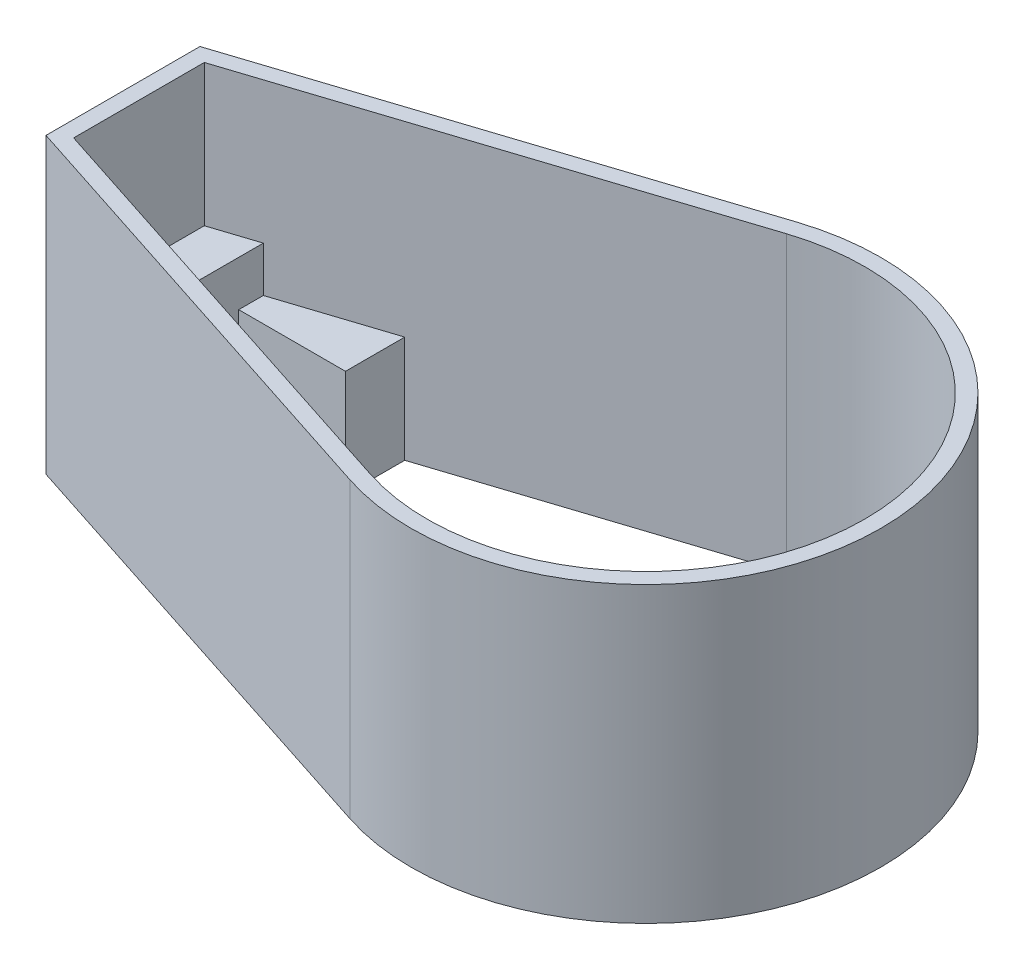
ISO-10303-21;
HEADER;
FILE_DESCRIPTION(('STEP AP214'),'2;1');
FILE_NAME('part.step','',(''),(''),'','','');
FILE_SCHEMA(('AUTOMOTIVE_DESIGN { 1 0 10303 214 1 1 1 1 }'));
ENDSEC;
DATA;
#1=APPLICATION_CONTEXT('core data for automotive mechanical design processes');
#2=APPLICATION_PROTOCOL_DEFINITION('international standard','automotive_design',2000,#1);
#3=PRODUCT_CONTEXT('',#1,'mechanical');
#4=PRODUCT('Part','Part','',(#3));
#5=PRODUCT_RELATED_PRODUCT_CATEGORY('part','',(#4));
#6=PRODUCT_DEFINITION_FORMATION('','',#4);
#7=PRODUCT_DEFINITION_CONTEXT('part definition',#1,'design');
#8=PRODUCT_DEFINITION('design','',#6,#7);
#9=PRODUCT_DEFINITION_SHAPE('','',#8);
#10=(LENGTH_UNIT() NAMED_UNIT(*) SI_UNIT(.MILLI.,.METRE.));
#11=(NAMED_UNIT(*) PLANE_ANGLE_UNIT() SI_UNIT($,.RADIAN.));
#12=(NAMED_UNIT(*) SI_UNIT($,.STERADIAN.) SOLID_ANGLE_UNIT());
#13=UNCERTAINTY_MEASURE_WITH_UNIT(LENGTH_MEASURE(1.E-05),#10,'distance_accuracy_value','');
#14=(GEOMETRIC_REPRESENTATION_CONTEXT(3) GLOBAL_UNCERTAINTY_ASSIGNED_CONTEXT((#13)) GLOBAL_UNIT_ASSIGNED_CONTEXT((#10,
#11,#12)) REPRESENTATION_CONTEXT('',''));
#15=CARTESIAN_POINT('',(0.,0.,0.));
#16=DIRECTION('',(0.,0.,1.));
#17=DIRECTION('',(1.,0.,0.));
#18=AXIS2_PLACEMENT_3D('',#15,#16,#17);
#19=CARTESIAN_POINT('',(-94.9999957586174,55.,-12.242580547085));
#20=DIRECTION('',(1.,0.,0.));
#21=DIRECTION('',(0.,0.,-1.));
#22=AXIS2_PLACEMENT_3D('',#19,#20,#21);
#23=PLANE('',#22);
#24=DIRECTION('',(0.,-1.,0.));
#25=VECTOR('',#24,1.);
#26=CARTESIAN_POINT('',(-94.9999957586174,55.,12.242580547085));
#27=LINE('',#26,#25);
#28=CARTESIAN_POINT('',(-94.9999957586174,55.,12.242580547085));
#29=VERTEX_POINT('',#28);
#30=CARTESIAN_POINT('',(-94.9999957586174,28.5,12.242580547085));
#31=VERTEX_POINT('',#30);
#32=EDGE_CURVE('E88',#29,#31,#27,.T.);
#33=ORIENTED_EDGE('',*,*,#32,.T.);
#34=DIRECTION('',(0.,0.,-1.));
#35=VECTOR('',#34,1.);
#36=CARTESIAN_POINT('',(-94.9999957586174,28.5,12.242580547085));
#37=LINE('',#36,#35);
#38=CARTESIAN_POINT('',(-94.9999957586174,28.5,-12.242580547085));
#39=VERTEX_POINT('',#38);
#40=EDGE_CURVE('E242',#31,#39,#37,.T.);
#41=ORIENTED_EDGE('',*,*,#40,.T.);
#42=DIRECTION('',(0.,-1.,0.));
#43=VECTOR('',#42,1.);
#44=CARTESIAN_POINT('',(-94.9999957586174,55.,-12.242580547085));
#45=LINE('',#44,#43);
#46=CARTESIAN_POINT('',(-94.9999957586174,55.,-12.242580547085));
#47=VERTEX_POINT('',#46);
#48=EDGE_CURVE('E271',#47,#39,#45,.T.);
#49=ORIENTED_EDGE('',*,*,#48,.F.);
#50=DIRECTION('',(0.,0.,1.));
#51=VECTOR('',#50,1.);
#52=CARTESIAN_POINT('',(-94.9999957586174,55.,-12.242580547085));
#53=LINE('',#52,#51);
#54=EDGE_CURVE('E258',#47,#29,#53,.T.);
#55=ORIENTED_EDGE('',*,*,#54,.T.);
#56=EDGE_LOOP('',(#33,#41,#49,#55));
#57=FACE_BOUND('',#56,.T.);
#58=ADVANCED_FACE('F63',(#57),#23,.T.);
#59=CARTESIAN_POINT('',(0.,55.,0.));
#60=DIRECTION('',(0.,-1.,0.));
#61=DIRECTION('',(0.,0.,-1.));
#62=AXIS2_PLACEMENT_3D('',#59,#60,#61);
#63=CYLINDRICAL_SURFACE('',#62,44.0000014399643);
#64=CARTESIAN_POINT('',(0.,0.,0.));
#65=DIRECTION('',(0.,-1.,0.));
#66=DIRECTION('',(0.,0.,-1.));
#67=AXIS2_PLACEMENT_3D('',#64,#65,#66);
#68=CIRCLE('',#67,44.0000014399643);
#69=CARTESIAN_POINT('',(-13.5967492993451,0.,-41.8464877284536));
#70=VERTEX_POINT('',#69);
#71=CARTESIAN_POINT('',(-13.5967492993451,0.,41.8464877284536));
#72=VERTEX_POINT('',#71);
#73=EDGE_CURVE('E270',#70,#72,#68,.T.);
#74=ORIENTED_EDGE('',*,*,#73,.F.);
#75=DIRECTION('',(0.,-1.,0.));
#76=VECTOR('',#75,1.);
#77=CARTESIAN_POINT('',(-13.5967492993451,55.,-41.8464877284536));
#78=LINE('',#77,#76);
#79=CARTESIAN_POINT('',(-13.5967492993451,55.,-41.8464877284536));
#80=VERTEX_POINT('',#79);
#81=EDGE_CURVE('E12',#80,#70,#78,.T.);
#82=ORIENTED_EDGE('',*,*,#81,.F.);
#83=CARTESIAN_POINT('',(0.,55.,0.));
#84=DIRECTION('',(0.,-1.,0.));
#85=DIRECTION('',(0.,0.,-1.));
#86=AXIS2_PLACEMENT_3D('',#83,#84,#85);
#87=CIRCLE('',#86,44.0000014399643);
#88=CARTESIAN_POINT('',(-13.5967492993451,55.,41.8464877284536));
#89=VERTEX_POINT('',#88);
#90=EDGE_CURVE('E276',#80,#89,#87,.T.);
#91=ORIENTED_EDGE('',*,*,#90,.T.);
#92=DIRECTION('',(0.,-1.,0.));
#93=VECTOR('',#92,1.);
#94=CARTESIAN_POINT('',(-13.5967492993451,55.,41.8464877284536));
#95=LINE('',#94,#93);
#96=EDGE_CURVE('E67',#89,#72,#95,.T.);
#97=ORIENTED_EDGE('',*,*,#96,.T.);
#98=EDGE_LOOP('',(#74,#82,#91,#97));
#99=FACE_BOUND('',#98,.T.);
#100=ADVANCED_FACE('F65',(#99),#63,.T.);
#101=CARTESIAN_POINT('',(-13.5967492993451,55.,-41.8464877284536));
#102=DIRECTION('',(0.309017019417537,0.,0.951056508158323));
#103=DIRECTION('',(0.951056508158323,0.,-0.309017019417537));
#104=AXIS2_PLACEMENT_3D('',#101,#102,#103);
#105=PLANE('',#104);
#106=DIRECTION('',(-0.951056508158323,0.,0.309017019417537));
#107=VECTOR('',#106,1.);
#108=CARTESIAN_POINT('',(-13.5967492993451,0.,-41.8464877284536));
#109=LINE('',#108,#107);
#110=CARTESIAN_POINT('',(-97.9999957586174,0.,-14.422208070755));
#111=VERTEX_POINT('',#110);
#112=EDGE_CURVE('E280',#70,#111,#109,.T.);
#113=ORIENTED_EDGE('',*,*,#112,.T.);
#114=DIRECTION('',(0.,-1.,0.));
#115=VECTOR('',#114,1.);
#116=CARTESIAN_POINT('',(-97.9999957586174,55.,-14.422208070755));
#117=LINE('',#116,#115);
#118=CARTESIAN_POINT('',(-97.9999957586174,55.,-14.422208070755));
#119=VERTEX_POINT('',#118);
#120=EDGE_CURVE('E72',#119,#111,#117,.T.);
#121=ORIENTED_EDGE('',*,*,#120,.F.);
#122=DIRECTION('',(-0.951056508158323,0.,0.309017019417537));
#123=VECTOR('',#122,1.);
#124=CARTESIAN_POINT('',(-13.5967492993451,55.,-41.8464877284536));
#125=LINE('',#124,#123);
#126=EDGE_CURVE('E284',#80,#119,#125,.T.);
#127=ORIENTED_EDGE('',*,*,#126,.F.);
#128=ORIENTED_EDGE('',*,*,#81,.T.);
#129=EDGE_LOOP('',(#113,#121,#127,#128));
#130=FACE_BOUND('',#129,.T.);
#131=ADVANCED_FACE('F312',(#130),#105,.F.);
#132=CARTESIAN_POINT('',(-97.9999957586174,55.,-14.422208070755));
#133=DIRECTION('',(1.,0.,0.));
#134=DIRECTION('',(0.,0.,-1.));
#135=AXIS2_PLACEMENT_3D('',#132,#133,#134);
#136=PLANE('',#135);
#137=DIRECTION('',(0.,0.,1.));
#138=VECTOR('',#137,1.);
#139=CARTESIAN_POINT('',(-97.9999957586174,0.,-14.422208070755));
#140=LINE('',#139,#138);
#141=CARTESIAN_POINT('',(-97.9999957586174,0.,14.422208070755));
#142=VERTEX_POINT('',#141);
#143=EDGE_CURVE('E291',#111,#142,#140,.T.);
#144=ORIENTED_EDGE('',*,*,#143,.T.);
#145=DIRECTION('',(0.,-1.,0.));
#146=VECTOR('',#145,1.);
#147=CARTESIAN_POINT('',(-97.9999957586174,55.,14.422208070755));
#148=LINE('',#147,#146);
#149=CARTESIAN_POINT('',(-97.9999957586174,55.,14.422208070755));
#150=VERTEX_POINT('',#149);
#151=EDGE_CURVE('E295',#150,#142,#148,.T.);
#152=ORIENTED_EDGE('',*,*,#151,.F.);
#153=DIRECTION('',(0.,0.,1.));
#154=VECTOR('',#153,1.);
#155=CARTESIAN_POINT('',(-97.9999957586174,55.,-14.422208070755));
#156=LINE('',#155,#154);
#157=EDGE_CURVE('E282',#119,#150,#156,.T.);
#158=ORIENTED_EDGE('',*,*,#157,.F.);
#159=ORIENTED_EDGE('',*,*,#120,.T.);
#160=EDGE_LOOP('',(#144,#152,#158,#159));
#161=FACE_BOUND('',#160,.T.);
#162=ADVANCED_FACE('F316',(#161),#136,.F.);
#163=CARTESIAN_POINT('',(-97.9999957586174,55.,14.422208070755));
#164=DIRECTION('',(0.309017019417537,0.,-0.951056508158323));
#165=DIRECTION('',(-0.951056508158323,0.,-0.309017019417537));
#166=AXIS2_PLACEMENT_3D('',#163,#164,#165);
#167=PLANE('',#166);
#168=DIRECTION('',(0.951056508158323,0.,0.309017019417537));
#169=VECTOR('',#168,1.);
#170=CARTESIAN_POINT('',(-97.9999957586174,0.,14.422208070755));
#171=LINE('',#170,#169);
#172=EDGE_CURVE('E288',#142,#72,#171,.T.);
#173=ORIENTED_EDGE('',*,*,#172,.T.);
#174=ORIENTED_EDGE('',*,*,#96,.F.);
#175=DIRECTION('',(0.951056508158323,0.,0.309017019417537));
#176=VECTOR('',#175,1.);
#177=CARTESIAN_POINT('',(-97.9999957586174,55.,14.422208070755));
#178=LINE('',#177,#176);
#179=EDGE_CURVE('E279',#150,#89,#178,.T.);
#180=ORIENTED_EDGE('',*,*,#179,.F.);
#181=ORIENTED_EDGE('',*,*,#151,.T.);
#182=EDGE_LOOP('',(#173,#174,#180,#181));
#183=FACE_BOUND('',#182,.T.);
#184=ADVANCED_FACE('F305',(#183),#167,.F.);
#185=CARTESIAN_POINT('',(0.,55.,0.));
#186=DIRECTION('',(0.,-1.,0.));
#187=DIRECTION('',(0.,0.,-1.));
#188=AXIS2_PLACEMENT_3D('',#185,#186,#187);
#189=PLANE('',#188);
#190=DIRECTION('',(-0.951056508158322,0.,0.309017019417537));
#191=VECTOR('',#190,1.);
#192=CARTESIAN_POINT('',(-12.6696982410925,55.,-38.9933182039786));
#193=LINE('',#192,#191);
#194=CARTESIAN_POINT('',(-12.6696982410925,55.,-38.9933182039786));
#195=VERTEX_POINT('',#194);
#196=EDGE_CURVE('E260',#195,#47,#193,.T.);
#197=ORIENTED_EDGE('',*,*,#196,.F.);
#198=CARTESIAN_POINT('',(0.,55.,0.));
#199=DIRECTION('',(0.,-1.,0.));
#200=DIRECTION('',(0.,0.,-1.));
#201=AXIS2_PLACEMENT_3D('',#198,#199,#200);
#202=CIRCLE('',#201,41.0000014399643);
#203=CARTESIAN_POINT('',(-12.6696982410925,55.,38.9933182039786));
#204=VERTEX_POINT('',#203);
#205=EDGE_CURVE('E252',#195,#204,#202,.T.);
#206=ORIENTED_EDGE('',*,*,#205,.T.);
#207=DIRECTION('',(0.951056508158322,0.,0.309017019417537));
#208=VECTOR('',#207,1.);
#209=CARTESIAN_POINT('',(-94.9999957586174,55.,12.242580547085));
#210=LINE('',#209,#208);
#211=EDGE_CURVE('E255',#29,#204,#210,.T.);
#212=ORIENTED_EDGE('',*,*,#211,.F.);
#213=ORIENTED_EDGE('',*,*,#54,.F.);
#214=EDGE_LOOP('',(#197,#206,#212,#213));
#215=FACE_BOUND('',#214,.T.);
#216=ORIENTED_EDGE('',*,*,#90,.F.);
#217=ORIENTED_EDGE('',*,*,#126,.T.);
#218=ORIENTED_EDGE('',*,*,#157,.T.);
#219=ORIENTED_EDGE('',*,*,#179,.T.);
#220=EDGE_LOOP('',(#216,#217,#218,#219));
#221=FACE_BOUND('',#220,.T.);
#222=ADVANCED_FACE('F318',(#215,#221),#189,.F.);
#223=CARTESIAN_POINT('',(0.,0.,0.));
#224=DIRECTION('',(0.,-1.,0.));
#225=DIRECTION('',(0.,0.,-1.));
#226=AXIS2_PLACEMENT_3D('',#223,#224,#225);
#227=PLANE('',#226);
#228=DIRECTION('',(0.,0.,1.));
#229=VECTOR('',#228,1.);
#230=CARTESIAN_POINT('',(-66.6530357586174,0.,10.35));
#231=LINE('',#230,#229);
#232=CARTESIAN_POINT('',(-66.6530357586174,0.,10.35));
#233=VERTEX_POINT('',#232);
#234=CARTESIAN_POINT('',(-66.6530357586174,0.,21.4530670046256));
#235=VERTEX_POINT('',#234);
#236=EDGE_CURVE('E372',#233,#235,#231,.T.);
#237=ORIENTED_EDGE('',*,*,#236,.T.);
#238=DIRECTION('',(0.951056508158322,0.,0.309017019417537));
#239=VECTOR('',#238,1.);
#240=CARTESIAN_POINT('',(-94.9999957586174,0.,12.242580547085));
#241=LINE('',#240,#239);
#242=CARTESIAN_POINT('',(-12.6696982410925,0.,38.9933182039786));
#243=VERTEX_POINT('',#242);
#244=EDGE_CURVE('E203',#235,#243,#241,.T.);
#245=ORIENTED_EDGE('',*,*,#244,.T.);
#246=CARTESIAN_POINT('',(0.,0.,0.));
#247=DIRECTION('',(0.,-1.,0.));
#248=DIRECTION('',(0.,0.,-1.));
#249=AXIS2_PLACEMENT_3D('',#246,#247,#248);
#250=CIRCLE('',#249,41.0000014399643);
#251=CARTESIAN_POINT('',(-12.6696982410925,0.,-38.9933182039786));
#252=VERTEX_POINT('',#251);
#253=EDGE_CURVE('E249',#252,#243,#250,.T.);
#254=ORIENTED_EDGE('',*,*,#253,.F.);
#255=DIRECTION('',(-0.951056508158322,0.,0.309017019417537));
#256=VECTOR('',#255,1.);
#257=CARTESIAN_POINT('',(-12.6696982410925,0.,-38.9933182039786));
#258=LINE('',#257,#256);
#259=CARTESIAN_POINT('',(-66.6530357586174,0.,-21.4530670046256));
#260=VERTEX_POINT('',#259);
#261=EDGE_CURVE('E256',#252,#260,#258,.T.);
#262=ORIENTED_EDGE('',*,*,#261,.T.);
#263=DIRECTION('',(0.,0.,1.));
#264=VECTOR('',#263,1.);
#265=CARTESIAN_POINT('',(-66.6530357586174,0.,-10.35));
#266=LINE('',#265,#264);
#267=CARTESIAN_POINT('',(-66.6530357586174,0.,-10.35));
#268=VERTEX_POINT('',#267);
#269=EDGE_CURVE('E224',#260,#268,#266,.T.);
#270=ORIENTED_EDGE('',*,*,#269,.T.);
#271=DIRECTION('',(-1.,0.,0.));
#272=VECTOR('',#271,1.);
#273=CARTESIAN_POINT('',(-86.6530357586174,0.,-10.35));
#274=LINE('',#273,#272);
#275=CARTESIAN_POINT('',(-86.6530357586174,0.,-10.35));
#276=VERTEX_POINT('',#275);
#277=EDGE_CURVE('E80',#268,#276,#274,.T.);
#278=ORIENTED_EDGE('',*,*,#277,.T.);
#279=DIRECTION('',(0.,0.,1.));
#280=VECTOR('',#279,1.);
#281=CARTESIAN_POINT('',(-86.6530357586174,0.,14.9546724977433));
#282=LINE('',#281,#280);
#283=CARTESIAN_POINT('',(-86.6530357586174,0.,10.35));
#284=VERTEX_POINT('',#283);
#285=EDGE_CURVE('E229',#276,#284,#282,.T.);
#286=ORIENTED_EDGE('',*,*,#285,.T.);
#287=DIRECTION('',(1.,0.,0.));
#288=VECTOR('',#287,1.);
#289=CARTESIAN_POINT('',(-86.6530357586174,0.,10.35));
#290=LINE('',#289,#288);
#291=EDGE_CURVE('E198',#284,#233,#290,.T.);
#292=ORIENTED_EDGE('',*,*,#291,.T.);
#293=EDGE_LOOP('',(#237,#245,#254,#262,#270,#278,#286,#292));
#294=FACE_BOUND('',#293,.T.);
#295=ORIENTED_EDGE('',*,*,#73,.T.);
#296=ORIENTED_EDGE('',*,*,#172,.F.);
#297=ORIENTED_EDGE('',*,*,#143,.F.);
#298=ORIENTED_EDGE('',*,*,#112,.F.);
#299=EDGE_LOOP('',(#295,#296,#297,#298));
#300=FACE_BOUND('',#299,.T.);
#301=ADVANCED_FACE('F309',(#294,#300),#227,.T.);
#302=CARTESIAN_POINT('',(0.,55.,0.));
#303=DIRECTION('',(0.,-1.,0.));
#304=DIRECTION('',(0.,0.,-1.));
#305=AXIS2_PLACEMENT_3D('',#302,#303,#304);
#306=CYLINDRICAL_SURFACE('',#305,41.0000014399643);
#307=ORIENTED_EDGE('',*,*,#253,.T.);
#308=DIRECTION('',(0.,-1.,0.));
#309=VECTOR('',#308,1.);
#310=CARTESIAN_POINT('',(-12.6696982410925,55.,38.9933182039786));
#311=LINE('',#310,#309);
#312=EDGE_CURVE('E262',#204,#243,#311,.T.);
#313=ORIENTED_EDGE('',*,*,#312,.F.);
#314=ORIENTED_EDGE('',*,*,#205,.F.);
#315=DIRECTION('',(0.,-1.,0.));
#316=VECTOR('',#315,1.);
#317=CARTESIAN_POINT('',(-12.6696982410925,55.,-38.9933182039786));
#318=LINE('',#317,#316);
#319=EDGE_CURVE('E268',#195,#252,#318,.T.);
#320=ORIENTED_EDGE('',*,*,#319,.T.);
#321=EDGE_LOOP('',(#307,#313,#314,#320));
#322=FACE_BOUND('',#321,.T.);
#323=ADVANCED_FACE('F327',(#322),#306,.F.);
#324=CARTESIAN_POINT('',(-12.6696982410925,55.,-38.9933182039786));
#325=DIRECTION('',(0.309017019417537,0.,0.951056508158323));
#326=DIRECTION('',(0.951056508158323,0.,-0.309017019417537));
#327=AXIS2_PLACEMENT_3D('',#324,#325,#326);
#328=PLANE('',#327);
#329=DIRECTION('',(0.,-1.,0.));
#330=VECTOR('',#329,1.);
#331=CARTESIAN_POINT('',(-66.6530357586174,20.,-21.4530670046256));
#332=LINE('',#331,#330);
#333=CARTESIAN_POINT('',(-66.6530357586174,20.,-21.4530670046256));
#334=VERTEX_POINT('',#333);
#335=EDGE_CURVE('E223',#334,#260,#332,.T.);
#336=ORIENTED_EDGE('',*,*,#335,.T.);
#337=ORIENTED_EDGE('',*,*,#261,.F.);
#338=ORIENTED_EDGE('',*,*,#319,.F.);
#339=ORIENTED_EDGE('',*,*,#196,.T.);
#340=ORIENTED_EDGE('',*,*,#48,.T.);
#341=DIRECTION('',(0.951056508158323,0.,-0.309017019417536));
#342=VECTOR('',#341,1.);
#343=CARTESIAN_POINT('',(-86.6530357586174,28.5,-14.9546724977433));
#344=LINE('',#343,#342);
#345=CARTESIAN_POINT('',(-86.6530357586174,28.5,-14.9546724977433));
#346=VERTEX_POINT('',#345);
#347=EDGE_CURVE('E234',#39,#346,#344,.T.);
#348=ORIENTED_EDGE('',*,*,#347,.T.);
#349=DIRECTION('',(0.,-1.,0.));
#350=VECTOR('',#349,1.);
#351=CARTESIAN_POINT('',(-86.6530357586174,28.5,-14.9546724977433));
#352=LINE('',#351,#350);
#353=CARTESIAN_POINT('',(-86.6530357586174,20.,-14.9546724977433));
#354=VERTEX_POINT('',#353);
#355=EDGE_CURVE('E245',#346,#354,#352,.T.);
#356=ORIENTED_EDGE('',*,*,#355,.T.);
#357=DIRECTION('',(0.951056508158323,0.,-0.309017019417537));
#358=VECTOR('',#357,1.);
#359=CARTESIAN_POINT('',(-66.6530357586174,20.,-21.4530670046256));
#360=LINE('',#359,#358);
#361=EDGE_CURVE('E212',#354,#334,#360,.T.);
#362=ORIENTED_EDGE('',*,*,#361,.T.);
#363=EDGE_LOOP('',(#336,#337,#338,#339,#340,#348,#356,#362));
#364=FACE_BOUND('',#363,.T.);
#365=ADVANCED_FACE('F339',(#364),#328,.T.);
#366=CARTESIAN_POINT('',(-94.9999957586174,55.,12.242580547085));
#367=DIRECTION('',(0.309017019417537,0.,-0.951056508158323));
#368=DIRECTION('',(-0.951056508158323,0.,-0.309017019417537));
#369=AXIS2_PLACEMENT_3D('',#366,#367,#368);
#370=PLANE('',#369);
#371=DIRECTION('',(0.,-1.,0.));
#372=VECTOR('',#371,1.);
#373=CARTESIAN_POINT('',(-66.6530357586174,20.,21.4530670046256));
#374=LINE('',#373,#372);
#375=CARTESIAN_POINT('',(-66.6530357586174,20.,21.4530670046256));
#376=VERTEX_POINT('',#375);
#377=EDGE_CURVE('E195',#376,#235,#374,.T.);
#378=ORIENTED_EDGE('',*,*,#377,.F.);
#379=DIRECTION('',(-0.951056508158323,0.,-0.309017019417537));
#380=VECTOR('',#379,1.);
#381=CARTESIAN_POINT('',(-66.6530357586174,20.,21.4530670046256));
#382=LINE('',#381,#380);
#383=CARTESIAN_POINT('',(-86.6530357586174,20.,14.9546724977433));
#384=VERTEX_POINT('',#383);
#385=EDGE_CURVE('E180',#376,#384,#382,.T.);
#386=ORIENTED_EDGE('',*,*,#385,.T.);
#387=DIRECTION('',(0.,-1.,0.));
#388=VECTOR('',#387,1.);
#389=CARTESIAN_POINT('',(-86.6530357586174,28.5,14.9546724977433));
#390=LINE('',#389,#388);
#391=CARTESIAN_POINT('',(-86.6530357586174,28.5,14.9546724977433));
#392=VERTEX_POINT('',#391);
#393=EDGE_CURVE('E247',#392,#384,#390,.T.);
#394=ORIENTED_EDGE('',*,*,#393,.F.);
#395=DIRECTION('',(-0.951056508158322,0.,-0.309017019417538));
#396=VECTOR('',#395,1.);
#397=CARTESIAN_POINT('',(-94.9999957586174,28.5,12.242580547085));
#398=LINE('',#397,#396);
#399=EDGE_CURVE('E240',#392,#31,#398,.T.);
#400=ORIENTED_EDGE('',*,*,#399,.T.);
#401=ORIENTED_EDGE('',*,*,#32,.F.);
#402=ORIENTED_EDGE('',*,*,#211,.T.);
#403=ORIENTED_EDGE('',*,*,#312,.T.);
#404=ORIENTED_EDGE('',*,*,#244,.F.);
#405=EDGE_LOOP('',(#378,#386,#394,#400,#401,#402,#403,#404));
#406=FACE_BOUND('',#405,.T.);
#407=ADVANCED_FACE('F201',(#406),#370,.T.);
#408=CARTESIAN_POINT('',(-86.6530357586174,28.5,14.9546724977433));
#409=DIRECTION('',(1.,0.,0.));
#410=DIRECTION('',(0.,0.,-1.));
#411=AXIS2_PLACEMENT_3D('',#408,#409,#410);
#412=PLANE('',#411);
#413=DIRECTION('',(0.,-1.,0.));
#414=VECTOR('',#413,1.);
#415=CARTESIAN_POINT('',(-86.6530357586174,20.,10.35));
#416=LINE('',#415,#414);
#417=CARTESIAN_POINT('',(-86.6530357586174,20.,10.35));
#418=VERTEX_POINT('',#417);
#419=EDGE_CURVE('E204',#418,#284,#416,.T.);
#420=ORIENTED_EDGE('',*,*,#419,.T.);
#421=ORIENTED_EDGE('',*,*,#285,.F.);
#422=DIRECTION('',(0.,-1.,0.));
#423=VECTOR('',#422,1.);
#424=CARTESIAN_POINT('',(-86.6530357586174,20.,-10.35));
#425=LINE('',#424,#423);
#426=CARTESIAN_POINT('',(-86.6530357586174,20.,-10.35));
#427=VERTEX_POINT('',#426);
#428=EDGE_CURVE('E227',#427,#276,#425,.T.);
#429=ORIENTED_EDGE('',*,*,#428,.F.);
#430=DIRECTION('',(0.,0.,-1.));
#431=VECTOR('',#430,1.);
#432=CARTESIAN_POINT('',(-86.6530357586174,20.,-14.9546724977433));
#433=LINE('',#432,#431);
#434=EDGE_CURVE('E220',#427,#354,#433,.T.);
#435=ORIENTED_EDGE('',*,*,#434,.T.);
#436=ORIENTED_EDGE('',*,*,#355,.F.);
#437=DIRECTION('',(0.,0.,1.));
#438=VECTOR('',#437,1.);
#439=CARTESIAN_POINT('',(-86.6530357586174,28.5,14.9546724977433));
#440=LINE('',#439,#438);
#441=EDGE_CURVE('E237',#346,#392,#440,.T.);
#442=ORIENTED_EDGE('',*,*,#441,.T.);
#443=ORIENTED_EDGE('',*,*,#393,.T.);
#444=DIRECTION('',(0.,0.,-1.));
#445=VECTOR('',#444,1.);
#446=CARTESIAN_POINT('',(-86.6530357586174,20.,14.9546724977433));
#447=LINE('',#446,#445);
#448=EDGE_CURVE('E187',#384,#418,#447,.T.);
#449=ORIENTED_EDGE('',*,*,#448,.T.);
#450=EDGE_LOOP('',(#420,#421,#429,#435,#436,#442,#443,#449));
#451=FACE_BOUND('',#450,.T.);
#452=ADVANCED_FACE('F342',(#451),#412,.T.);
#453=CARTESIAN_POINT('',(0.,28.5,0.));
#454=DIRECTION('',(0.,-1.,0.));
#455=DIRECTION('',(0.,0.,-1.));
#456=AXIS2_PLACEMENT_3D('',#453,#454,#455);
#457=PLANE('',#456);
#458=ORIENTED_EDGE('',*,*,#347,.F.);
#459=ORIENTED_EDGE('',*,*,#40,.F.);
#460=ORIENTED_EDGE('',*,*,#399,.F.);
#461=ORIENTED_EDGE('',*,*,#441,.F.);
#462=EDGE_LOOP('',(#458,#459,#460,#461));
#463=FACE_BOUND('',#462,.T.);
#464=ADVANCED_FACE('F357',(#463),#457,.F.);
#465=CARTESIAN_POINT('',(-86.6530357586174,20.,-10.35));
#466=DIRECTION('',(0.,0.,1.));
#467=DIRECTION('',(1.,0.,0.));
#468=AXIS2_PLACEMENT_3D('',#465,#466,#467);
#469=PLANE('',#468);
#470=ORIENTED_EDGE('',*,*,#277,.F.);
#471=DIRECTION('',(0.,-1.,0.));
#472=VECTOR('',#471,1.);
#473=CARTESIAN_POINT('',(-66.6530357586174,20.,-10.35));
#474=LINE('',#473,#472);
#475=CARTESIAN_POINT('',(-66.6530357586174,20.,-10.35));
#476=VERTEX_POINT('',#475);
#477=EDGE_CURVE('E230',#476,#268,#474,.T.);
#478=ORIENTED_EDGE('',*,*,#477,.F.);
#479=DIRECTION('',(-1.,0.,0.));
#480=VECTOR('',#479,1.);
#481=CARTESIAN_POINT('',(-86.6530357586174,20.,-10.35));
#482=LINE('',#481,#480);
#483=EDGE_CURVE('E218',#476,#427,#482,.T.);
#484=ORIENTED_EDGE('',*,*,#483,.T.);
#485=ORIENTED_EDGE('',*,*,#428,.T.);
#486=EDGE_LOOP('',(#470,#478,#484,#485));
#487=FACE_BOUND('',#486,.T.);
#488=ADVANCED_FACE('F368',(#487),#469,.T.);
#489=CARTESIAN_POINT('',(-66.6530357586174,20.,-10.35));
#490=DIRECTION('',(1.,0.,0.));
#491=DIRECTION('',(0.,0.,-1.));
#492=AXIS2_PLACEMENT_3D('',#489,#490,#491);
#493=PLANE('',#492);
#494=ORIENTED_EDGE('',*,*,#269,.F.);
#495=ORIENTED_EDGE('',*,*,#335,.F.);
#496=DIRECTION('',(0.,0.,1.));
#497=VECTOR('',#496,1.);
#498=CARTESIAN_POINT('',(-66.6530357586174,20.,-10.35));
#499=LINE('',#498,#497);
#500=EDGE_CURVE('E215',#334,#476,#499,.T.);
#501=ORIENTED_EDGE('',*,*,#500,.T.);
#502=ORIENTED_EDGE('',*,*,#477,.T.);
#503=EDGE_LOOP('',(#494,#495,#501,#502));
#504=FACE_BOUND('',#503,.T.);
#505=ADVANCED_FACE('F370',(#504),#493,.T.);
#506=CARTESIAN_POINT('',(0.,20.,0.));
#507=DIRECTION('',(0.,1.,0.));
#508=DIRECTION('',(0.,0.,1.));
#509=AXIS2_PLACEMENT_3D('',#506,#507,#508);
#510=PLANE('',#509);
#511=ORIENTED_EDGE('',*,*,#361,.F.);
#512=ORIENTED_EDGE('',*,*,#434,.F.);
#513=ORIENTED_EDGE('',*,*,#483,.F.);
#514=ORIENTED_EDGE('',*,*,#500,.F.);
#515=EDGE_LOOP('',(#511,#512,#513,#514));
#516=FACE_BOUND('',#515,.T.);
#517=ADVANCED_FACE('F363',(#516),#510,.T.);
#518=CARTESIAN_POINT('',(-66.6530357586174,20.,10.35));
#519=DIRECTION('',(1.,0.,0.));
#520=DIRECTION('',(0.,0.,-1.));
#521=AXIS2_PLACEMENT_3D('',#518,#519,#520);
#522=PLANE('',#521);
#523=ORIENTED_EDGE('',*,*,#236,.F.);
#524=DIRECTION('',(0.,-1.,0.));
#525=VECTOR('',#524,1.);
#526=CARTESIAN_POINT('',(-66.6530357586174,20.,10.35));
#527=LINE('',#526,#525);
#528=CARTESIAN_POINT('',(-66.6530357586174,20.,10.35));
#529=VERTEX_POINT('',#528);
#530=EDGE_CURVE('E197',#529,#233,#527,.T.);
#531=ORIENTED_EDGE('',*,*,#530,.F.);
#532=DIRECTION('',(0.,0.,1.));
#533=VECTOR('',#532,1.);
#534=CARTESIAN_POINT('',(-66.6530357586174,20.,10.35));
#535=LINE('',#534,#533);
#536=EDGE_CURVE('E184',#529,#376,#535,.T.);
#537=ORIENTED_EDGE('',*,*,#536,.T.);
#538=ORIENTED_EDGE('',*,*,#377,.T.);
#539=EDGE_LOOP('',(#523,#531,#537,#538));
#540=FACE_BOUND('',#539,.T.);
#541=ADVANCED_FACE('F194',(#540),#522,.T.);
#542=CARTESIAN_POINT('',(-86.6530357586174,20.,10.35));
#543=DIRECTION('',(0.,0.,-1.));
#544=DIRECTION('',(-1.,0.,0.));
#545=AXIS2_PLACEMENT_3D('',#542,#543,#544);
#546=PLANE('',#545);
#547=ORIENTED_EDGE('',*,*,#291,.F.);
#548=ORIENTED_EDGE('',*,*,#419,.F.);
#549=DIRECTION('',(1.,0.,0.));
#550=VECTOR('',#549,1.);
#551=CARTESIAN_POINT('',(-86.6530357586174,20.,10.35));
#552=LINE('',#551,#550);
#553=EDGE_CURVE('E205',#418,#529,#552,.T.);
#554=ORIENTED_EDGE('',*,*,#553,.T.);
#555=ORIENTED_EDGE('',*,*,#530,.T.);
#556=EDGE_LOOP('',(#547,#548,#554,#555));
#557=FACE_BOUND('',#556,.T.);
#558=ADVANCED_FACE('F377',(#557),#546,.T.);
#559=CARTESIAN_POINT('',(0.,20.,0.));
#560=DIRECTION('',(0.,1.,0.));
#561=DIRECTION('',(0.,0.,1.));
#562=AXIS2_PLACEMENT_3D('',#559,#560,#561);
#563=PLANE('',#562);
#564=ORIENTED_EDGE('',*,*,#536,.F.);
#565=ORIENTED_EDGE('',*,*,#553,.F.);
#566=ORIENTED_EDGE('',*,*,#448,.F.);
#567=ORIENTED_EDGE('',*,*,#385,.F.);
#568=EDGE_LOOP('',(#564,#565,#566,#567));
#569=FACE_BOUND('',#568,.T.);
#570=ADVANCED_FACE('F182',(#569),#563,.T.);
#571=CLOSED_SHELL('',(#58,#100,#131,#162,#184,#222,#301,#323,#365,#407,#452,#464,#488,#505,#517,
#541,#558,#570));
#572=MANIFOLD_SOLID_BREP('B2',#571);
#573=ADVANCED_BREP_SHAPE_REPRESENTATION('',(#18,#572),#14);
#574=SHAPE_DEFINITION_REPRESENTATION(#9,#573);
ENDSEC;
END-ISO-10303-21;
